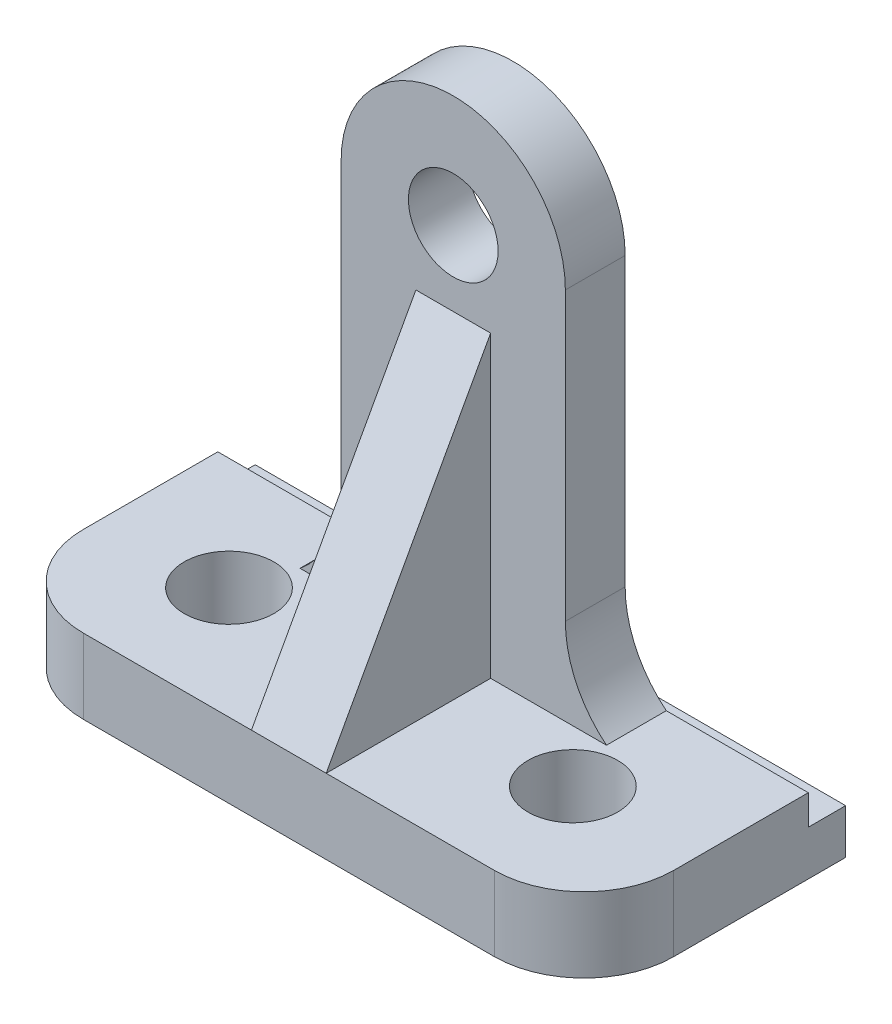
ISO-10303-21;
HEADER;
FILE_DESCRIPTION(('STEP AP214'),'2;1');
FILE_NAME('part.step','',(''),(''),'','','');
FILE_SCHEMA(('AUTOMOTIVE_DESIGN { 1 0 10303 214 1 1 1 1 }'));
ENDSEC;
DATA;
#1=APPLICATION_CONTEXT('core data for automotive mechanical design processes');
#2=APPLICATION_PROTOCOL_DEFINITION('international standard','automotive_design',2000,#1);
#3=PRODUCT_CONTEXT('',#1,'mechanical');
#4=PRODUCT('Part','Part','',(#3));
#5=PRODUCT_RELATED_PRODUCT_CATEGORY('part','',(#4));
#6=PRODUCT_DEFINITION_FORMATION('','',#4);
#7=PRODUCT_DEFINITION_CONTEXT('part definition',#1,'design');
#8=PRODUCT_DEFINITION('design','',#6,#7);
#9=PRODUCT_DEFINITION_SHAPE('','',#8);
#10=(LENGTH_UNIT() NAMED_UNIT(*) SI_UNIT(.MILLI.,.METRE.));
#11=(NAMED_UNIT(*) PLANE_ANGLE_UNIT() SI_UNIT($,.RADIAN.));
#12=(NAMED_UNIT(*) SI_UNIT($,.STERADIAN.) SOLID_ANGLE_UNIT());
#13=UNCERTAINTY_MEASURE_WITH_UNIT(LENGTH_MEASURE(1.E-05),#10,'distance_accuracy_value','');
#14=(GEOMETRIC_REPRESENTATION_CONTEXT(3) GLOBAL_UNCERTAINTY_ASSIGNED_CONTEXT((#13)) GLOBAL_UNIT_ASSIGNED_CONTEXT((#10,
#11,#12)) REPRESENTATION_CONTEXT('',''));
#15=CARTESIAN_POINT('',(0.,0.,0.));
#16=DIRECTION('',(0.,0.,1.));
#17=DIRECTION('',(1.,0.,0.));
#18=AXIS2_PLACEMENT_3D('',#15,#16,#17);
#19=CARTESIAN_POINT('',(27.5,10.,23.));
#20=DIRECTION('',(0.,-1.,0.));
#21=DIRECTION('',(0.,0.,-1.));
#22=AXIS2_PLACEMENT_3D('',#19,#20,#21);
#23=PLANE('',#22);
#24=CARTESIAN_POINT('',(-23.,10.,20.));
#25=DIRECTION('',(0.,1.,0.));
#26=DIRECTION('',(0.,0.,-1.));
#27=AXIS2_PLACEMENT_3D('',#24,#25,#26);
#28=CIRCLE('',#27,6.);
#29=CARTESIAN_POINT('',(-23.,10.,26.));
#30=VERTEX_POINT('',#29);
#31=EDGE_CURVE('E231',#30,#30,#28,.T.);
#32=ORIENTED_EDGE('',*,*,#31,.F.);
#33=EDGE_LOOP('',(#32));
#34=FACE_BOUND('',#33,.T.);
#35=DIRECTION('',(0.,0.,1.));
#36=VECTOR('',#35,1.);
#37=CARTESIAN_POINT('',(-5.,10.,23.));
#38=LINE('',#37,#36);
#39=CARTESIAN_POINT('',(-5.,10.,13.));
#40=VERTEX_POINT('',#39);
#41=CARTESIAN_POINT('',(-5.,10.,35.));
#42=VERTEX_POINT('',#41);
#43=EDGE_CURVE('E150',#40,#42,#38,.T.);
#44=ORIENTED_EDGE('',*,*,#43,.F.);
#45=DIRECTION('',(1.,0.,0.));
#46=VECTOR('',#45,1.);
#47=CARTESIAN_POINT('',(-20.5,10.,13.));
#48=LINE('',#47,#46);
#49=CARTESIAN_POINT('',(-20.5,10.,13.));
#50=VERTEX_POINT('',#49);
#51=EDGE_CURVE('E264',#50,#40,#48,.T.);
#52=ORIENTED_EDGE('',*,*,#51,.F.);
#53=DIRECTION('',(0.,0.,-1.));
#54=VECTOR('',#53,1.);
#55=CARTESIAN_POINT('',(-20.5,10.,13.));
#56=LINE('',#55,#54);
#57=CARTESIAN_POINT('',(-20.5,10.,5.));
#58=VERTEX_POINT('',#57);
#59=EDGE_CURVE('E279',#50,#58,#56,.T.);
#60=ORIENTED_EDGE('',*,*,#59,.T.);
#61=DIRECTION('',(1.,0.,0.));
#62=VECTOR('',#61,1.);
#63=CARTESIAN_POINT('',(-45.9031242374329,10.,5.));
#64=LINE('',#63,#62);
#65=CARTESIAN_POINT('',(-39.5,10.,5.));
#66=VERTEX_POINT('',#65);
#67=EDGE_CURVE('E301',#66,#58,#64,.T.);
#68=ORIENTED_EDGE('',*,*,#67,.F.);
#69=DIRECTION('',(0.,0.,1.));
#70=VECTOR('',#69,1.);
#71=CARTESIAN_POINT('',(-39.5,10.,23.));
#72=LINE('',#71,#70);
#73=CARTESIAN_POINT('',(-39.5,10.,23.));
#74=VERTEX_POINT('',#73);
#75=EDGE_CURVE('E208',#66,#74,#72,.T.);
#76=ORIENTED_EDGE('',*,*,#75,.T.);
#77=CARTESIAN_POINT('',(-27.5,10.,23.));
#78=DIRECTION('',(0.,1.,0.));
#79=DIRECTION('',(0.,0.,-1.));
#80=AXIS2_PLACEMENT_3D('',#77,#78,#79);
#81=CIRCLE('',#80,12.);
#82=CARTESIAN_POINT('',(-27.5,10.,35.));
#83=VERTEX_POINT('',#82);
#84=EDGE_CURVE('E181',#74,#83,#81,.T.);
#85=ORIENTED_EDGE('',*,*,#84,.T.);
#86=DIRECTION('',(1.,0.,0.));
#87=VECTOR('',#86,1.);
#88=CARTESIAN_POINT('',(27.5,10.,35.));
#89=LINE('',#88,#87);
#90=EDGE_CURVE('E175',#83,#42,#89,.T.);
#91=ORIENTED_EDGE('',*,*,#90,.T.);
#92=EDGE_LOOP('',(#44,#52,#60,#68,#76,#85,#91));
#93=FACE_BOUND('',#92,.T.);
#94=ADVANCED_FACE('F32',(#34,#93),#23,.F.);
#95=CARTESIAN_POINT('',(23.,10.,20.));
#96=DIRECTION('',(0.,1.,0.));
#97=DIRECTION('',(0.,0.,1.));
#98=AXIS2_PLACEMENT_3D('',#95,#96,#97);
#99=CIRCLE('',#98,6.);
#100=CARTESIAN_POINT('',(23.,10.,26.));
#101=VERTEX_POINT('',#100);
#102=EDGE_CURVE('E223',#101,#101,#99,.T.);
#103=ORIENTED_EDGE('',*,*,#102,.F.);
#104=EDGE_LOOP('',(#103));
#105=FACE_BOUND('',#104,.T.);
#106=CARTESIAN_POINT('',(5.,10.,13.));
#107=VERTEX_POINT('',#106);
#108=CARTESIAN_POINT('',(20.5,10.,13.));
#109=VERTEX_POINT('',#108);
#110=EDGE_CURVE('E263',#107,#109,#48,.T.);
#111=ORIENTED_EDGE('',*,*,#110,.F.);
#112=DIRECTION('',(0.,0.,1.));
#113=VECTOR('',#112,1.);
#114=CARTESIAN_POINT('',(5.,10.,23.));
#115=LINE('',#114,#113);
#116=CARTESIAN_POINT('',(5.,10.,35.));
#117=VERTEX_POINT('',#116);
#118=EDGE_CURVE('E236',#107,#117,#115,.T.);
#119=ORIENTED_EDGE('',*,*,#118,.T.);
#120=CARTESIAN_POINT('',(27.5,10.,35.));
#121=VERTEX_POINT('',#120);
#122=EDGE_CURVE('E177',#117,#121,#89,.T.);
#123=ORIENTED_EDGE('',*,*,#122,.T.);
#124=CARTESIAN_POINT('',(27.5,10.,23.));
#125=DIRECTION('',(0.,1.,0.));
#126=DIRECTION('',(0.,0.,-1.));
#127=AXIS2_PLACEMENT_3D('',#124,#125,#126);
#128=CIRCLE('',#127,12.);
#129=CARTESIAN_POINT('',(39.5,10.,23.));
#130=VERTEX_POINT('',#129);
#131=EDGE_CURVE('E183',#121,#130,#128,.T.);
#132=ORIENTED_EDGE('',*,*,#131,.T.);
#133=DIRECTION('',(0.,0.,-1.));
#134=VECTOR('',#133,1.);
#135=CARTESIAN_POINT('',(39.5,10.,0.));
#136=LINE('',#135,#134);
#137=CARTESIAN_POINT('',(39.5,10.,5.));
#138=VERTEX_POINT('',#137);
#139=EDGE_CURVE('E185',#130,#138,#136,.T.);
#140=ORIENTED_EDGE('',*,*,#139,.T.);
#141=CARTESIAN_POINT('',(20.5,10.,5.));
#142=VERTEX_POINT('',#141);
#143=EDGE_CURVE('E297',#142,#138,#64,.T.);
#144=ORIENTED_EDGE('',*,*,#143,.F.);
#145=DIRECTION('',(0.,0.,-1.));
#146=VECTOR('',#145,1.);
#147=CARTESIAN_POINT('',(20.5,10.,13.));
#148=LINE('',#147,#146);
#149=EDGE_CURVE('E276',#109,#142,#148,.T.);
#150=ORIENTED_EDGE('',*,*,#149,.F.);
#151=EDGE_LOOP('',(#111,#119,#123,#132,#140,#144,#150));
#152=FACE_BOUND('',#151,.T.);
#153=ADVANCED_FACE('F333',(#105,#152),#23,.F.);
#154=CARTESIAN_POINT('',(-39.5,10.,23.));
#155=DIRECTION('',(1.,0.,0.));
#156=DIRECTION('',(0.,0.,-1.));
#157=AXIS2_PLACEMENT_3D('',#154,#155,#156);
#158=PLANE('',#157);
#159=DIRECTION('',(0.,1.,0.));
#160=VECTOR('',#159,1.);
#161=CARTESIAN_POINT('',(-39.5,6.,5.));
#162=LINE('',#161,#160);
#163=CARTESIAN_POINT('',(-39.5,6.,5.));
#164=VERTEX_POINT('',#163);
#165=EDGE_CURVE('E197',#164,#66,#162,.T.);
#166=ORIENTED_EDGE('',*,*,#165,.F.);
#167=DIRECTION('',(0.,0.,1.));
#168=VECTOR('',#167,1.);
#169=CARTESIAN_POINT('',(-39.5,6.,0.));
#170=LINE('',#169,#168);
#171=CARTESIAN_POINT('',(-39.5,6.,0.));
#172=VERTEX_POINT('',#171);
#173=EDGE_CURVE('E289',#172,#164,#170,.T.);
#174=ORIENTED_EDGE('',*,*,#173,.F.);
#175=DIRECTION('',(0.,-1.,0.));
#176=VECTOR('',#175,1.);
#177=CARTESIAN_POINT('',(-39.5,10.,0.));
#178=LINE('',#177,#176);
#179=CARTESIAN_POINT('',(-39.5,0.,0.));
#180=VERTEX_POINT('',#179);
#181=EDGE_CURVE('E192',#172,#180,#178,.T.);
#182=ORIENTED_EDGE('',*,*,#181,.T.);
#183=DIRECTION('',(0.,0.,1.));
#184=VECTOR('',#183,1.);
#185=CARTESIAN_POINT('',(-39.5,0.,23.));
#186=LINE('',#185,#184);
#187=CARTESIAN_POINT('',(-39.5,0.,23.));
#188=VERTEX_POINT('',#187);
#189=EDGE_CURVE('E193',#180,#188,#186,.T.);
#190=ORIENTED_EDGE('',*,*,#189,.T.);
#191=DIRECTION('',(0.,-1.,0.));
#192=VECTOR('',#191,1.);
#193=CARTESIAN_POINT('',(-39.5,10.,23.));
#194=LINE('',#193,#192);
#195=EDGE_CURVE('E41',#74,#188,#194,.T.);
#196=ORIENTED_EDGE('',*,*,#195,.F.);
#197=ORIENTED_EDGE('',*,*,#75,.F.);
#198=EDGE_LOOP('',(#166,#174,#182,#190,#196,#197));
#199=FACE_BOUND('',#198,.T.);
#200=ADVANCED_FACE('F34',(#199),#158,.F.);
#201=CARTESIAN_POINT('',(-27.5,10.,23.));
#202=DIRECTION('',(0.,-1.,0.));
#203=DIRECTION('',(0.,0.,-1.));
#204=AXIS2_PLACEMENT_3D('',#201,#202,#203);
#205=CYLINDRICAL_SURFACE('',#204,12.);
#206=CARTESIAN_POINT('',(-27.5,0.,23.));
#207=DIRECTION('',(0.,1.,0.));
#208=DIRECTION('',(0.,0.,-1.));
#209=AXIS2_PLACEMENT_3D('',#206,#207,#208);
#210=CIRCLE('',#209,12.);
#211=CARTESIAN_POINT('',(-27.5,0.,35.));
#212=VERTEX_POINT('',#211);
#213=EDGE_CURVE('E196',#188,#212,#210,.T.);
#214=ORIENTED_EDGE('',*,*,#213,.T.);
#215=DIRECTION('',(0.,-1.,0.));
#216=VECTOR('',#215,1.);
#217=CARTESIAN_POINT('',(-27.5,10.,35.));
#218=LINE('',#217,#216);
#219=EDGE_CURVE('E219',#83,#212,#218,.T.);
#220=ORIENTED_EDGE('',*,*,#219,.F.);
#221=ORIENTED_EDGE('',*,*,#84,.F.);
#222=ORIENTED_EDGE('',*,*,#195,.T.);
#223=EDGE_LOOP('',(#214,#220,#221,#222));
#224=FACE_BOUND('',#223,.T.);
#225=ADVANCED_FACE('F310',(#224),#205,.T.);
#226=CARTESIAN_POINT('',(27.5,10.,35.));
#227=DIRECTION('',(0.,0.,-1.));
#228=DIRECTION('',(-1.,0.,0.));
#229=AXIS2_PLACEMENT_3D('',#226,#227,#228);
#230=PLANE('',#229);
#231=ORIENTED_EDGE('',*,*,#122,.F.);
#232=DIRECTION('',(-1.,0.,0.));
#233=VECTOR('',#232,1.);
#234=CARTESIAN_POINT('',(27.5,10.,35.));
#235=LINE('',#234,#233);
#236=EDGE_CURVE('E164',#42,#117,#235,.F.);
#237=ORIENTED_EDGE('',*,*,#236,.F.);
#238=ORIENTED_EDGE('',*,*,#90,.F.);
#239=ORIENTED_EDGE('',*,*,#219,.T.);
#240=DIRECTION('',(1.,0.,0.));
#241=VECTOR('',#240,1.);
#242=CARTESIAN_POINT('',(27.5,0.,35.));
#243=LINE('',#242,#241);
#244=CARTESIAN_POINT('',(27.5,0.,35.));
#245=VERTEX_POINT('',#244);
#246=EDGE_CURVE('E199',#212,#245,#243,.T.);
#247=ORIENTED_EDGE('',*,*,#246,.T.);
#248=DIRECTION('',(0.,-1.,0.));
#249=VECTOR('',#248,1.);
#250=CARTESIAN_POINT('',(27.5,10.,35.));
#251=LINE('',#250,#249);
#252=EDGE_CURVE('E216',#121,#245,#251,.T.);
#253=ORIENTED_EDGE('',*,*,#252,.F.);
#254=EDGE_LOOP('',(#231,#237,#238,#239,#247,#253));
#255=FACE_BOUND('',#254,.T.);
#256=ADVANCED_FACE('F173',(#255),#230,.F.);
#257=CARTESIAN_POINT('',(27.5,10.,23.));
#258=DIRECTION('',(0.,-1.,0.));
#259=DIRECTION('',(0.,0.,-1.));
#260=AXIS2_PLACEMENT_3D('',#257,#258,#259);
#261=CYLINDRICAL_SURFACE('',#260,12.);
#262=CARTESIAN_POINT('',(27.5,0.,23.));
#263=DIRECTION('',(0.,1.,0.));
#264=DIRECTION('',(0.,0.,-1.));
#265=AXIS2_PLACEMENT_3D('',#262,#263,#264);
#266=CIRCLE('',#265,12.);
#267=CARTESIAN_POINT('',(39.5,0.,23.));
#268=VERTEX_POINT('',#267);
#269=EDGE_CURVE('E201',#245,#268,#266,.T.);
#270=ORIENTED_EDGE('',*,*,#269,.T.);
#271=DIRECTION('',(0.,-1.,0.));
#272=VECTOR('',#271,1.);
#273=CARTESIAN_POINT('',(39.5,10.,23.));
#274=LINE('',#273,#272);
#275=EDGE_CURVE('E213',#130,#268,#274,.T.);
#276=ORIENTED_EDGE('',*,*,#275,.F.);
#277=ORIENTED_EDGE('',*,*,#131,.F.);
#278=ORIENTED_EDGE('',*,*,#252,.T.);
#279=EDGE_LOOP('',(#270,#276,#277,#278));
#280=FACE_BOUND('',#279,.T.);
#281=ADVANCED_FACE('F322',(#280),#261,.T.);
#282=CARTESIAN_POINT('',(39.5,10.,0.));
#283=DIRECTION('',(-1.,0.,0.));
#284=DIRECTION('',(0.,0.,1.));
#285=AXIS2_PLACEMENT_3D('',#282,#283,#284);
#286=PLANE('',#285);
#287=DIRECTION('',(0.,-1.,0.));
#288=VECTOR('',#287,1.);
#289=CARTESIAN_POINT('',(39.5,10.,0.));
#290=LINE('',#289,#288);
#291=CARTESIAN_POINT('',(39.5,6.,0.));
#292=VERTEX_POINT('',#291);
#293=CARTESIAN_POINT('',(39.5,0.,0.));
#294=VERTEX_POINT('',#293);
#295=EDGE_CURVE('E211',#292,#294,#290,.T.);
#296=ORIENTED_EDGE('',*,*,#295,.F.);
#297=DIRECTION('',(0.,0.,-1.));
#298=VECTOR('',#297,1.);
#299=CARTESIAN_POINT('',(39.5,6.,0.));
#300=LINE('',#299,#298);
#301=CARTESIAN_POINT('',(39.5,6.,5.));
#302=VERTEX_POINT('',#301);
#303=EDGE_CURVE('E294',#302,#292,#300,.T.);
#304=ORIENTED_EDGE('',*,*,#303,.F.);
#305=DIRECTION('',(0.,-1.,0.));
#306=VECTOR('',#305,1.);
#307=CARTESIAN_POINT('',(39.5,6.,5.));
#308=LINE('',#307,#306);
#309=EDGE_CURVE('E288',#138,#302,#308,.T.);
#310=ORIENTED_EDGE('',*,*,#309,.F.);
#311=ORIENTED_EDGE('',*,*,#139,.F.);
#312=ORIENTED_EDGE('',*,*,#275,.T.);
#313=DIRECTION('',(0.,0.,-1.));
#314=VECTOR('',#313,1.);
#315=CARTESIAN_POINT('',(39.5,0.,0.));
#316=LINE('',#315,#314);
#317=EDGE_CURVE('E203',#268,#294,#316,.T.);
#318=ORIENTED_EDGE('',*,*,#317,.T.);
#319=EDGE_LOOP('',(#296,#304,#310,#311,#312,#318));
#320=FACE_BOUND('',#319,.T.);
#321=ADVANCED_FACE('F326',(#320),#286,.F.);
#322=CARTESIAN_POINT('',(-39.5,10.,0.));
#323=DIRECTION('',(0.,0.,1.));
#324=DIRECTION('',(1.,0.,0.));
#325=AXIS2_PLACEMENT_3D('',#322,#323,#324);
#326=PLANE('',#325);
#327=DIRECTION('',(-1.,0.,0.));
#328=VECTOR('',#327,1.);
#329=CARTESIAN_POINT('',(-39.5,0.,0.));
#330=LINE('',#329,#328);
#331=EDGE_CURVE('E206',#294,#180,#330,.T.);
#332=ORIENTED_EDGE('',*,*,#331,.T.);
#333=ORIENTED_EDGE('',*,*,#181,.F.);
#334=DIRECTION('',(1.,0.,0.));
#335=VECTOR('',#334,1.);
#336=CARTESIAN_POINT('',(-45.9031242374329,6.,0.));
#337=LINE('',#336,#335);
#338=EDGE_CURVE('E291',#172,#292,#337,.T.);
#339=ORIENTED_EDGE('',*,*,#338,.T.);
#340=ORIENTED_EDGE('',*,*,#295,.T.);
#341=EDGE_LOOP('',(#332,#333,#339,#340));
#342=FACE_BOUND('',#341,.T.);
#343=ADVANCED_FACE('F349',(#342),#326,.F.);
#344=CARTESIAN_POINT('',(27.5,0.,23.));
#345=DIRECTION('',(0.,-1.,0.));
#346=DIRECTION('',(0.,0.,-1.));
#347=AXIS2_PLACEMENT_3D('',#344,#345,#346);
#348=PLANE('',#347);
#349=CARTESIAN_POINT('',(-23.,0.,20.));
#350=DIRECTION('',(0.,-1.,0.));
#351=DIRECTION('',(0.,0.,-1.));
#352=AXIS2_PLACEMENT_3D('',#349,#350,#351);
#353=CIRCLE('',#352,6.);
#354=CARTESIAN_POINT('',(-23.,0.,26.));
#355=VERTEX_POINT('',#354);
#356=EDGE_CURVE('E36',#355,#355,#353,.T.);
#357=ORIENTED_EDGE('',*,*,#356,.F.);
#358=EDGE_LOOP('',(#357));
#359=FACE_BOUND('',#358,.T.);
#360=CARTESIAN_POINT('',(23.,0.,20.));
#361=DIRECTION('',(0.,-1.,0.));
#362=DIRECTION('',(0.,0.,-1.));
#363=AXIS2_PLACEMENT_3D('',#360,#361,#362);
#364=CIRCLE('',#363,6.);
#365=CARTESIAN_POINT('',(23.,0.,26.));
#366=VERTEX_POINT('',#365);
#367=EDGE_CURVE('E168',#366,#366,#364,.T.);
#368=ORIENTED_EDGE('',*,*,#367,.F.);
#369=EDGE_LOOP('',(#368));
#370=FACE_BOUND('',#369,.T.);
#371=ORIENTED_EDGE('',*,*,#269,.F.);
#372=ORIENTED_EDGE('',*,*,#246,.F.);
#373=ORIENTED_EDGE('',*,*,#213,.F.);
#374=ORIENTED_EDGE('',*,*,#189,.F.);
#375=ORIENTED_EDGE('',*,*,#331,.F.);
#376=ORIENTED_EDGE('',*,*,#317,.F.);
#377=EDGE_LOOP('',(#371,#372,#373,#374,#375,#376));
#378=FACE_BOUND('',#377,.T.);
#379=ADVANCED_FACE('F317',(#359,#370,#378),#348,.T.);
#380=CARTESIAN_POINT('',(-45.9031242374329,6.,0.));
#381=DIRECTION('',(0.,-1.,0.));
#382=DIRECTION('',(0.,0.,-1.));
#383=AXIS2_PLACEMENT_3D('',#380,#381,#382);
#384=PLANE('',#383);
#385=ORIENTED_EDGE('',*,*,#303,.T.);
#386=ORIENTED_EDGE('',*,*,#338,.F.);
#387=ORIENTED_EDGE('',*,*,#173,.T.);
#388=DIRECTION('',(1.,0.,0.));
#389=VECTOR('',#388,1.);
#390=CARTESIAN_POINT('',(-45.9031242374329,6.,5.));
#391=LINE('',#390,#389);
#392=EDGE_CURVE('E299',#164,#302,#391,.T.);
#393=ORIENTED_EDGE('',*,*,#392,.T.);
#394=EDGE_LOOP('',(#385,#386,#387,#393));
#395=FACE_BOUND('',#394,.T.);
#396=ADVANCED_FACE('F350',(#395),#384,.F.);
#397=CARTESIAN_POINT('',(-45.9031242374329,6.,5.));
#398=DIRECTION('',(0.,0.,1.));
#399=DIRECTION('',(0.,-1.,0.));
#400=AXIS2_PLACEMENT_3D('',#397,#398,#399);
#401=PLANE('',#400);
#402=CARTESIAN_POINT('',(0.,60.,4.99999999999998));
#403=DIRECTION('',(0.,0.,1.));
#404=DIRECTION('',(0.,-1.,0.));
#405=AXIS2_PLACEMENT_3D('',#402,#403,#404);
#406=CIRCLE('',#405,6.);
#407=CARTESIAN_POINT('',(6.,60.,4.99999999999998));
#408=VERTEX_POINT('',#407);
#409=EDGE_CURVE('E244',#408,#408,#406,.T.);
#410=ORIENTED_EDGE('',*,*,#409,.T.);
#411=EDGE_LOOP('',(#410));
#412=FACE_BOUND('',#411,.T.);
#413=ORIENTED_EDGE('',*,*,#309,.T.);
#414=ORIENTED_EDGE('',*,*,#392,.F.);
#415=ORIENTED_EDGE('',*,*,#165,.T.);
#416=ORIENTED_EDGE('',*,*,#67,.T.);
#417=CARTESIAN_POINT('',(-30.,21.6081867662439,5.));
#418=DIRECTION('',(0.,0.,1.));
#419=DIRECTION('',(0.,-1.,0.));
#420=AXIS2_PLACEMENT_3D('',#417,#418,#419);
#421=CIRCLE('',#420,15.);
#422=CARTESIAN_POINT('',(-15.,21.6081867662439,5.00000000000001));
#423=VERTEX_POINT('',#422);
#424=EDGE_CURVE('E254',#423,#58,#421,.F.);
#425=ORIENTED_EDGE('',*,*,#424,.F.);
#426=DIRECTION('',(0.,-1.,0.));
#427=VECTOR('',#426,1.);
#428=CARTESIAN_POINT('',(-15.,60.,5.));
#429=LINE('',#428,#427);
#430=CARTESIAN_POINT('',(-15.,60.,5.));
#431=VERTEX_POINT('',#430);
#432=EDGE_CURVE('E251',#431,#423,#429,.T.);
#433=ORIENTED_EDGE('',*,*,#432,.F.);
#434=CARTESIAN_POINT('',(0.,60.,5.));
#435=DIRECTION('',(0.,0.,1.));
#436=DIRECTION('',(0.,-1.,0.));
#437=AXIS2_PLACEMENT_3D('',#434,#435,#436);
#438=CIRCLE('',#437,15.);
#439=CARTESIAN_POINT('',(15.,60.,5.00000000000001));
#440=VERTEX_POINT('',#439);
#441=EDGE_CURVE('E57',#440,#431,#438,.T.);
#442=ORIENTED_EDGE('',*,*,#441,.F.);
#443=DIRECTION('',(0.,1.,0.));
#444=VECTOR('',#443,1.);
#445=CARTESIAN_POINT('',(15.,60.,5.));
#446=LINE('',#445,#444);
#447=CARTESIAN_POINT('',(15.,21.6081867662439,5.00000000000001));
#448=VERTEX_POINT('',#447);
#449=EDGE_CURVE('E11',#448,#440,#446,.T.);
#450=ORIENTED_EDGE('',*,*,#449,.F.);
#451=CARTESIAN_POINT('',(30.,21.6081867662439,5.));
#452=DIRECTION('',(0.,0.,1.));
#453=DIRECTION('',(0.,-1.,0.));
#454=AXIS2_PLACEMENT_3D('',#451,#452,#453);
#455=CIRCLE('',#454,15.);
#456=EDGE_CURVE('E247',#142,#448,#455,.F.);
#457=ORIENTED_EDGE('',*,*,#456,.F.);
#458=ORIENTED_EDGE('',*,*,#143,.T.);
#459=EDGE_LOOP('',(#413,#414,#415,#416,#425,#433,#442,#450,#457,#458));
#460=FACE_BOUND('',#459,.T.);
#461=ADVANCED_FACE('F345',(#412,#460),#401,.F.);
#462=CARTESIAN_POINT('',(0.,60.,13.));
#463=DIRECTION('',(0.,0.,-1.));
#464=DIRECTION('',(-1.,0.,0.));
#465=AXIS2_PLACEMENT_3D('',#462,#463,#464);
#466=CYLINDRICAL_SURFACE('',#465,15.);
#467=ORIENTED_EDGE('',*,*,#441,.T.);
#468=DIRECTION('',(0.,0.,-1.));
#469=VECTOR('',#468,1.);
#470=CARTESIAN_POINT('',(-15.,60.,13.));
#471=LINE('',#470,#469);
#472=CARTESIAN_POINT('',(-15.,60.,13.));
#473=VERTEX_POINT('',#472);
#474=EDGE_CURVE('E285',#473,#431,#471,.T.);
#475=ORIENTED_EDGE('',*,*,#474,.F.);
#476=CARTESIAN_POINT('',(0.,60.,13.));
#477=DIRECTION('',(0.,0.,1.));
#478=DIRECTION('',(1.,0.,0.));
#479=AXIS2_PLACEMENT_3D('',#476,#477,#478);
#480=CIRCLE('',#479,15.);
#481=CARTESIAN_POINT('',(15.,60.,13.));
#482=VERTEX_POINT('',#481);
#483=EDGE_CURVE('E256',#482,#473,#480,.T.);
#484=ORIENTED_EDGE('',*,*,#483,.F.);
#485=DIRECTION('',(0.,0.,-1.));
#486=VECTOR('',#485,1.);
#487=CARTESIAN_POINT('',(15.,60.,13.));
#488=LINE('',#487,#486);
#489=EDGE_CURVE('E270',#482,#440,#488,.T.);
#490=ORIENTED_EDGE('',*,*,#489,.T.);
#491=EDGE_LOOP('',(#467,#475,#484,#490));
#492=FACE_BOUND('',#491,.T.);
#493=ADVANCED_FACE('F361',(#492),#466,.T.);
#494=CARTESIAN_POINT('',(-15.,60.,13.));
#495=DIRECTION('',(1.,0.,0.));
#496=DIRECTION('',(0.,1.,0.));
#497=AXIS2_PLACEMENT_3D('',#494,#495,#496);
#498=PLANE('',#497);
#499=ORIENTED_EDGE('',*,*,#474,.T.);
#500=ORIENTED_EDGE('',*,*,#432,.T.);
#501=DIRECTION('',(0.,0.,-1.));
#502=VECTOR('',#501,1.);
#503=CARTESIAN_POINT('',(-15.,21.6081867662439,13.));
#504=LINE('',#503,#502);
#505=CARTESIAN_POINT('',(-15.,21.6081867662439,13.));
#506=VERTEX_POINT('',#505);
#507=EDGE_CURVE('E282',#506,#423,#504,.T.);
#508=ORIENTED_EDGE('',*,*,#507,.F.);
#509=DIRECTION('',(0.,-1.,0.));
#510=VECTOR('',#509,1.);
#511=CARTESIAN_POINT('',(-15.,60.,13.));
#512=LINE('',#511,#510);
#513=EDGE_CURVE('E259',#473,#506,#512,.T.);
#514=ORIENTED_EDGE('',*,*,#513,.F.);
#515=EDGE_LOOP('',(#499,#500,#508,#514));
#516=FACE_BOUND('',#515,.T.);
#517=ADVANCED_FACE('F363',(#516),#498,.F.);
#518=CARTESIAN_POINT('',(-30.,21.6081867662439,13.));
#519=DIRECTION('',(0.,0.,-1.));
#520=DIRECTION('',(-1.,0.,0.));
#521=AXIS2_PLACEMENT_3D('',#518,#519,#520);
#522=CYLINDRICAL_SURFACE('',#521,15.);
#523=ORIENTED_EDGE('',*,*,#507,.T.);
#524=ORIENTED_EDGE('',*,*,#424,.T.);
#525=ORIENTED_EDGE('',*,*,#59,.F.);
#526=CARTESIAN_POINT('',(-30.,21.6081867662439,13.));
#527=DIRECTION('',(0.,0.,-1.));
#528=DIRECTION('',(-1.,0.,0.));
#529=AXIS2_PLACEMENT_3D('',#526,#527,#528);
#530=CIRCLE('',#529,15.);
#531=EDGE_CURVE('E261',#506,#50,#530,.T.);
#532=ORIENTED_EDGE('',*,*,#531,.F.);
#533=EDGE_LOOP('',(#523,#524,#525,#532));
#534=FACE_BOUND('',#533,.T.);
#535=ADVANCED_FACE('F365',(#534),#522,.F.);
#536=CARTESIAN_POINT('',(30.,21.6081867662439,13.));
#537=DIRECTION('',(0.,0.,-1.));
#538=DIRECTION('',(-1.,0.,0.));
#539=AXIS2_PLACEMENT_3D('',#536,#537,#538);
#540=CYLINDRICAL_SURFACE('',#539,15.);
#541=ORIENTED_EDGE('',*,*,#149,.T.);
#542=ORIENTED_EDGE('',*,*,#456,.T.);
#543=DIRECTION('',(0.,0.,-1.));
#544=VECTOR('',#543,1.);
#545=CARTESIAN_POINT('',(15.,21.6081867662439,13.));
#546=LINE('',#545,#544);
#547=CARTESIAN_POINT('',(15.,21.6081867662439,13.));
#548=VERTEX_POINT('',#547);
#549=EDGE_CURVE('E273',#548,#448,#546,.T.);
#550=ORIENTED_EDGE('',*,*,#549,.F.);
#551=CARTESIAN_POINT('',(30.,21.6081867662439,13.));
#552=DIRECTION('',(0.,0.,-1.));
#553=DIRECTION('',(1.,0.,0.));
#554=AXIS2_PLACEMENT_3D('',#551,#552,#553);
#555=CIRCLE('',#554,15.);
#556=EDGE_CURVE('E266',#109,#548,#555,.T.);
#557=ORIENTED_EDGE('',*,*,#556,.F.);
#558=EDGE_LOOP('',(#541,#542,#550,#557));
#559=FACE_BOUND('',#558,.T.);
#560=ADVANCED_FACE('F353',(#559),#540,.F.);
#561=CARTESIAN_POINT('',(15.,60.,13.));
#562=DIRECTION('',(-1.,0.,0.));
#563=DIRECTION('',(0.,0.,1.));
#564=AXIS2_PLACEMENT_3D('',#561,#562,#563);
#565=PLANE('',#564);
#566=ORIENTED_EDGE('',*,*,#549,.T.);
#567=ORIENTED_EDGE('',*,*,#449,.T.);
#568=ORIENTED_EDGE('',*,*,#489,.F.);
#569=DIRECTION('',(0.,1.,0.));
#570=VECTOR('',#569,1.);
#571=CARTESIAN_POINT('',(15.,60.,13.));
#572=LINE('',#571,#570);
#573=EDGE_CURVE('E268',#548,#482,#572,.T.);
#574=ORIENTED_EDGE('',*,*,#573,.F.);
#575=EDGE_LOOP('',(#566,#567,#568,#574));
#576=FACE_BOUND('',#575,.T.);
#577=ADVANCED_FACE('F359',(#576),#565,.F.);
#578=CARTESIAN_POINT('',(0.,60.,13.));
#579=DIRECTION('',(0.,0.,1.));
#580=DIRECTION('',(1.,0.,0.));
#581=AXIS2_PLACEMENT_3D('',#578,#579,#580);
#582=PLANE('',#581);
#583=DIRECTION('',(0.,1.,0.));
#584=VECTOR('',#583,1.);
#585=CARTESIAN_POINT('',(5.,60.,13.));
#586=LINE('',#585,#584);
#587=CARTESIAN_POINT('',(5.,50.,13.));
#588=VERTEX_POINT('',#587);
#589=EDGE_CURVE('E239',#107,#588,#586,.T.);
#590=ORIENTED_EDGE('',*,*,#589,.F.);
#591=ORIENTED_EDGE('',*,*,#110,.T.);
#592=ORIENTED_EDGE('',*,*,#556,.T.);
#593=ORIENTED_EDGE('',*,*,#573,.T.);
#594=ORIENTED_EDGE('',*,*,#483,.T.);
#595=ORIENTED_EDGE('',*,*,#513,.T.);
#596=ORIENTED_EDGE('',*,*,#531,.T.);
#597=ORIENTED_EDGE('',*,*,#51,.T.);
#598=DIRECTION('',(0.,1.,0.));
#599=VECTOR('',#598,1.);
#600=CARTESIAN_POINT('',(-5.,60.,13.));
#601=LINE('',#600,#599);
#602=CARTESIAN_POINT('',(-5.,50.,13.));
#603=VERTEX_POINT('',#602);
#604=EDGE_CURVE('E153',#40,#603,#601,.T.);
#605=ORIENTED_EDGE('',*,*,#604,.T.);
#606=DIRECTION('',(1.,0.,0.));
#607=VECTOR('',#606,1.);
#608=CARTESIAN_POINT('',(0.,50.,13.));
#609=LINE('',#608,#607);
#610=EDGE_CURVE('E167',#588,#603,#609,.F.);
#611=ORIENTED_EDGE('',*,*,#610,.F.);
#612=EDGE_LOOP('',(#590,#591,#592,#593,#594,#595,#596,#597,#605,#611));
#613=FACE_BOUND('',#612,.T.);
#614=CARTESIAN_POINT('',(0.,60.,13.));
#615=DIRECTION('',(0.,0.,1.));
#616=DIRECTION('',(1.,0.,0.));
#617=AXIS2_PLACEMENT_3D('',#614,#615,#616);
#618=CIRCLE('',#617,6.);
#619=CARTESIAN_POINT('',(6.,60.,13.));
#620=VERTEX_POINT('',#619);
#621=EDGE_CURVE('E178',#620,#620,#618,.T.);
#622=ORIENTED_EDGE('',*,*,#621,.F.);
#623=EDGE_LOOP('',(#622));
#624=FACE_BOUND('',#623,.T.);
#625=ADVANCED_FACE('F339',(#613,#624),#582,.T.);
#626=CARTESIAN_POINT('',(0.,60.,0.));
#627=DIRECTION('',(0.,0.,1.));
#628=DIRECTION('',(1.,0.,0.));
#629=AXIS2_PLACEMENT_3D('',#626,#627,#628);
#630=CYLINDRICAL_SURFACE('',#629,6.);
#631=CARTESIAN_POINT('',(6.,60.,4.99999999999998));
#632=CARTESIAN_POINT('',(6.,60.,5.08333333333331));
#633=CARTESIAN_POINT('',(6.,60.,5.16666666666664));
#634=CARTESIAN_POINT('',(6.,60.,5.33333333333331));
#635=CARTESIAN_POINT('',(6.,60.,5.41666666666664));
#636=CARTESIAN_POINT('',(6.,60.,5.58333333333331));
#637=CARTESIAN_POINT('',(6.,60.,5.66666666666664));
#638=CARTESIAN_POINT('',(6.,60.,5.83333333333331));
#639=CARTESIAN_POINT('',(6.,60.,5.91666666666664));
#640=CARTESIAN_POINT('',(6.,60.,6.08333333333331));
#641=CARTESIAN_POINT('',(6.,60.,6.16666666666665));
#642=CARTESIAN_POINT('',(6.,60.,6.33333333333331));
#643=CARTESIAN_POINT('',(6.,60.,6.41666666666665));
#644=CARTESIAN_POINT('',(6.,60.,6.58333333333331));
#645=CARTESIAN_POINT('',(6.,60.,6.66666666666665));
#646=CARTESIAN_POINT('',(6.,60.,6.83333333333331));
#647=CARTESIAN_POINT('',(6.,60.,6.91666666666665));
#648=CARTESIAN_POINT('',(6.,60.,7.08333333333332));
#649=CARTESIAN_POINT('',(6.,60.,7.16666666666665));
#650=CARTESIAN_POINT('',(6.,60.,7.33333333333332));
#651=CARTESIAN_POINT('',(6.,60.,7.41666666666665));
#652=CARTESIAN_POINT('',(6.,60.,7.58333333333332));
#653=CARTESIAN_POINT('',(6.,60.,7.66666666666665));
#654=CARTESIAN_POINT('',(6.,60.,7.83333333333332));
#655=CARTESIAN_POINT('',(6.,60.,7.91666666666665));
#656=CARTESIAN_POINT('',(6.,60.,8.08333333333332));
#657=CARTESIAN_POINT('',(6.,60.,8.16666666666665));
#658=CARTESIAN_POINT('',(6.,60.,8.33333333333332));
#659=CARTESIAN_POINT('',(6.,60.,8.41666666666665));
#660=CARTESIAN_POINT('',(6.,60.,8.58333333333332));
#661=CARTESIAN_POINT('',(6.,60.,8.66666666666665));
#662=CARTESIAN_POINT('',(6.,60.,8.83333333333332));
#663=CARTESIAN_POINT('',(6.,60.,8.91666666666665));
#664=CARTESIAN_POINT('',(6.,60.,9.08333333333332));
#665=CARTESIAN_POINT('',(6.,60.,9.16666666666666));
#666=CARTESIAN_POINT('',(6.,60.,9.33333333333332));
#667=CARTESIAN_POINT('',(6.,60.,9.41666666666666));
#668=CARTESIAN_POINT('',(6.,60.,9.58333333333332));
#669=CARTESIAN_POINT('',(6.,60.,9.66666666666666));
#670=CARTESIAN_POINT('',(6.,60.,9.83333333333332));
#671=CARTESIAN_POINT('',(6.,60.,9.91666666666666));
#672=CARTESIAN_POINT('',(6.,60.,10.0833333333333));
#673=CARTESIAN_POINT('',(6.,60.,10.1666666666667));
#674=CARTESIAN_POINT('',(6.,60.,10.3333333333333));
#675=CARTESIAN_POINT('',(6.,60.,10.4166666666667));
#676=CARTESIAN_POINT('',(6.,60.,10.5833333333333));
#677=CARTESIAN_POINT('',(6.,60.,10.6666666666667));
#678=CARTESIAN_POINT('',(6.,60.,10.8333333333333));
#679=CARTESIAN_POINT('',(6.,60.,10.9166666666667));
#680=CARTESIAN_POINT('',(6.,60.,11.0833333333333));
#681=CARTESIAN_POINT('',(6.,60.,11.1666666666667));
#682=CARTESIAN_POINT('',(6.,60.,11.3333333333333));
#683=CARTESIAN_POINT('',(6.,60.,11.4166666666667));
#684=CARTESIAN_POINT('',(6.,60.,11.5833333333333));
#685=CARTESIAN_POINT('',(6.,60.,11.6666666666667));
#686=CARTESIAN_POINT('',(6.,60.,11.8333333333333));
#687=CARTESIAN_POINT('',(6.,60.,11.9166666666667));
#688=CARTESIAN_POINT('',(6.,60.,12.0833333333333));
#689=CARTESIAN_POINT('',(6.,60.,12.1666666666667));
#690=CARTESIAN_POINT('',(6.,60.,12.3333333333333));
#691=CARTESIAN_POINT('',(6.,60.,12.4166666666667));
#692=CARTESIAN_POINT('',(6.,60.,12.5833333333333));
#693=CARTESIAN_POINT('',(6.,60.,12.6666666666667));
#694=CARTESIAN_POINT('',(6.,60.,12.8333333333333));
#695=CARTESIAN_POINT('',(6.,60.,12.9166666666667));
#696=CARTESIAN_POINT('',(6.,60.,13.));
#697=B_SPLINE_CURVE_WITH_KNOTS('',3,(#631,#632,#633,#634,#635,#636,#637,#638,#639,#640,#641,
#642,#643,#644,#645,#646,#647,#648,#649,#650,#651,#652,#653,#654,#655,#656,#657,#658,#659,#660,
#661,#662,#663,#664,#665,#666,#667,#668,#669,#670,#671,#672,#673,#674,#675,#676,#677,#678,#679,
#680,#681,#682,#683,#684,#685,#686,#687,#688,#689,#690,#691,#692,#693,#694,#695,#696),
.UNSPECIFIED.,.F.,.F.,(4,2,2,2,2,2,2,2,2,2,2,2,2,2,2,2,2,2,2,2,2,2,2,2,2,2,2,2,2,2,2,2,4),(0.,
0.250000000000001,0.500000000000001,0.750000000000002,1.,1.25,1.5,1.75000000000001,
2.00000000000001,2.25000000000001,2.50000000000001,2.75000000000001,3.00000000000001,
3.25000000000001,3.50000000000001,3.75000000000001,4.00000000000001,4.25000000000001,
4.50000000000001,4.75000000000001,5.00000000000001,5.25000000000001,5.50000000000002,
5.75000000000002,6.00000000000002,6.25000000000002,6.50000000000002,6.75000000000002,
7.00000000000002,7.25000000000002,7.50000000000002,7.75000000000002,8.00000000000002),.UNSPECIFIED.);
#698=EDGE_CURVE('BSEAM453',#408,#620,#697,.T.);
#699=ORIENTED_EDGE('',*,*,#409,.F.);
#700=ORIENTED_EDGE('',*,*,#621,.T.);
#701=ORIENTED_EDGE('',*,*,#698,.T.);
#702=ORIENTED_EDGE('',*,*,#698,.F.);
#703=EDGE_LOOP('',(#699,#701,#700,#702));
#704=FACE_BOUND('',#703,.T.);
#705=ADVANCED_FACE('F453',(#704),#630,.F.);
#706=CARTESIAN_POINT('',(0.,10.,35.));
#707=DIRECTION('',(0.,-0.481918749772156,-0.876215908676647));
#708=DIRECTION('',(0.,0.876215908676647,-0.481918749772156));
#709=AXIS2_PLACEMENT_3D('',#706,#707,#708);
#710=PLANE('',#709);
#711=DIRECTION('',(0.,0.876215908676647,-0.481918749772156));
#712=VECTOR('',#711,1.);
#713=CARTESIAN_POINT('',(-5.,10.,35.));
#714=LINE('',#713,#712);
#715=EDGE_CURVE('E49',#42,#603,#714,.T.);
#716=ORIENTED_EDGE('',*,*,#715,.F.);
#717=ORIENTED_EDGE('',*,*,#236,.T.);
#718=DIRECTION('',(0.,0.876215908676647,-0.481918749772156));
#719=VECTOR('',#718,1.);
#720=CARTESIAN_POINT('',(5.,10.,35.));
#721=LINE('',#720,#719);
#722=EDGE_CURVE('E158',#117,#588,#721,.T.);
#723=ORIENTED_EDGE('',*,*,#722,.T.);
#724=ORIENTED_EDGE('',*,*,#610,.T.);
#725=EDGE_LOOP('',(#716,#717,#723,#724));
#726=FACE_BOUND('',#725,.T.);
#727=ADVANCED_FACE('F162',(#726),#710,.F.);
#728=CARTESIAN_POINT('',(5.,37.5,17.5));
#729=DIRECTION('',(1.,0.,0.));
#730=DIRECTION('',(0.,0.,-1.));
#731=AXIS2_PLACEMENT_3D('',#728,#729,#730);
#732=PLANE('',#731);
#733=ORIENTED_EDGE('',*,*,#118,.F.);
#734=ORIENTED_EDGE('',*,*,#589,.T.);
#735=ORIENTED_EDGE('',*,*,#722,.F.);
#736=EDGE_LOOP('',(#733,#734,#735));
#737=FACE_BOUND('',#736,.T.);
#738=ADVANCED_FACE('F337',(#737),#732,.T.);
#739=CARTESIAN_POINT('',(-5.,37.5,17.5));
#740=DIRECTION('',(1.,0.,0.));
#741=DIRECTION('',(0.,0.,-1.));
#742=AXIS2_PLACEMENT_3D('',#739,#740,#741);
#743=PLANE('',#742);
#744=ORIENTED_EDGE('',*,*,#604,.F.);
#745=ORIENTED_EDGE('',*,*,#43,.T.);
#746=ORIENTED_EDGE('',*,*,#715,.T.);
#747=EDGE_LOOP('',(#744,#745,#746));
#748=FACE_BOUND('',#747,.T.);
#749=ADVANCED_FACE('F151',(#748),#743,.F.);
#750=CARTESIAN_POINT('',(23.,-3.,20.));
#751=DIRECTION('',(0.,1.,0.));
#752=DIRECTION('',(0.,0.,1.));
#753=AXIS2_PLACEMENT_3D('',#750,#751,#752);
#754=CYLINDRICAL_SURFACE('',#753,6.);
#755=CARTESIAN_POINT('',(23.,0.,26.));
#756=CARTESIAN_POINT('',(23.,0.104166666666667,26.));
#757=CARTESIAN_POINT('',(23.,0.208333333333334,26.));
#758=CARTESIAN_POINT('',(23.,0.416666666666667,26.));
#759=CARTESIAN_POINT('',(23.,0.520833333333334,26.));
#760=CARTESIAN_POINT('',(23.,0.729166666666667,26.));
#761=CARTESIAN_POINT('',(23.,0.833333333333333,26.));
#762=CARTESIAN_POINT('',(23.,1.04166666666667,26.));
#763=CARTESIAN_POINT('',(23.,1.14583333333333,26.));
#764=CARTESIAN_POINT('',(23.,1.35416666666667,26.));
#765=CARTESIAN_POINT('',(23.,1.45833333333333,26.));
#766=CARTESIAN_POINT('',(23.,1.66666666666667,26.));
#767=CARTESIAN_POINT('',(23.,1.77083333333333,26.));
#768=CARTESIAN_POINT('',(23.,1.97916666666667,26.));
#769=CARTESIAN_POINT('',(23.,2.08333333333333,26.));
#770=CARTESIAN_POINT('',(23.,2.29166666666667,26.));
#771=CARTESIAN_POINT('',(23.,2.39583333333333,26.));
#772=CARTESIAN_POINT('',(23.,2.60416666666667,26.));
#773=CARTESIAN_POINT('',(23.,2.70833333333333,26.));
#774=CARTESIAN_POINT('',(23.,2.91666666666667,26.));
#775=CARTESIAN_POINT('',(23.,3.02083333333333,26.));
#776=CARTESIAN_POINT('',(23.,3.22916666666667,26.));
#777=CARTESIAN_POINT('',(23.,3.33333333333333,26.));
#778=CARTESIAN_POINT('',(23.,3.54166666666667,26.));
#779=CARTESIAN_POINT('',(23.,3.64583333333333,26.));
#780=CARTESIAN_POINT('',(23.,3.85416666666667,26.));
#781=CARTESIAN_POINT('',(23.,3.95833333333333,26.));
#782=CARTESIAN_POINT('',(23.,4.16666666666667,26.));
#783=CARTESIAN_POINT('',(23.,4.27083333333333,26.));
#784=CARTESIAN_POINT('',(23.,4.47916666666667,26.));
#785=CARTESIAN_POINT('',(23.,4.58333333333333,26.));
#786=CARTESIAN_POINT('',(23.,4.79166666666667,26.));
#787=CARTESIAN_POINT('',(23.,4.89583333333333,26.));
#788=CARTESIAN_POINT('',(23.,5.10416666666667,26.));
#789=CARTESIAN_POINT('',(23.,5.20833333333333,26.));
#790=CARTESIAN_POINT('',(23.,5.41666666666667,26.));
#791=CARTESIAN_POINT('',(23.,5.52083333333333,26.));
#792=CARTESIAN_POINT('',(23.,5.72916666666667,26.));
#793=CARTESIAN_POINT('',(23.,5.83333333333333,26.));
#794=CARTESIAN_POINT('',(23.,6.04166666666667,26.));
#795=CARTESIAN_POINT('',(23.,6.14583333333333,26.));
#796=CARTESIAN_POINT('',(23.,6.35416666666667,26.));
#797=CARTESIAN_POINT('',(23.,6.45833333333333,26.));
#798=CARTESIAN_POINT('',(23.,6.66666666666667,26.));
#799=CARTESIAN_POINT('',(23.,6.77083333333333,26.));
#800=CARTESIAN_POINT('',(23.,6.97916666666667,26.));
#801=CARTESIAN_POINT('',(23.,7.08333333333333,26.));
#802=CARTESIAN_POINT('',(23.,7.29166666666667,26.));
#803=CARTESIAN_POINT('',(23.,7.39583333333333,26.));
#804=CARTESIAN_POINT('',(23.,7.60416666666667,26.));
#805=CARTESIAN_POINT('',(23.,7.70833333333334,26.));
#806=CARTESIAN_POINT('',(23.,7.91666666666667,26.));
#807=CARTESIAN_POINT('',(23.,8.02083333333333,26.));
#808=CARTESIAN_POINT('',(23.,8.22916666666667,26.));
#809=CARTESIAN_POINT('',(23.,8.33333333333334,26.));
#810=CARTESIAN_POINT('',(23.,8.54166666666667,26.));
#811=CARTESIAN_POINT('',(23.,8.64583333333333,26.));
#812=CARTESIAN_POINT('',(23.,8.85416666666667,26.));
#813=CARTESIAN_POINT('',(23.,8.95833333333333,26.));
#814=CARTESIAN_POINT('',(23.,9.16666666666667,26.));
#815=CARTESIAN_POINT('',(23.,9.27083333333333,26.));
#816=CARTESIAN_POINT('',(23.,9.47916666666667,26.));
#817=CARTESIAN_POINT('',(23.,9.58333333333333,26.));
#818=CARTESIAN_POINT('',(23.,9.79166666666667,26.));
#819=CARTESIAN_POINT('',(23.,9.89583333333333,26.));
#820=CARTESIAN_POINT('',(23.,10.,26.));
#821=B_SPLINE_CURVE_WITH_KNOTS('',3,(#755,#756,#757,#758,#759,#760,#761,#762,#763,#764,#765,
#766,#767,#768,#769,#770,#771,#772,#773,#774,#775,#776,#777,#778,#779,#780,#781,#782,#783,#784,
#785,#786,#787,#788,#789,#790,#791,#792,#793,#794,#795,#796,#797,#798,#799,#800,#801,#802,#803,
#804,#805,#806,#807,#808,#809,#810,#811,#812,#813,#814,#815,#816,#817,#818,#819,#820),
.UNSPECIFIED.,.F.,.F.,(4,2,2,2,2,2,2,2,2,2,2,2,2,2,2,2,2,2,2,2,2,2,2,2,2,2,2,2,2,2,2,2,4),(0.,
0.3125,0.625,0.9375,1.25,1.5625,1.875,2.1875,2.5,2.8125,3.125,3.4375,3.75,4.0625,4.375,4.6875,
5.,5.3125,5.625,5.9375,6.25,6.5625,6.875,7.1875,7.5,7.8125,8.125,8.4375,8.75,9.0625,9.375,
9.6875,10.),.UNSPECIFIED.);
#822=EDGE_CURVE('BSEAM426',#366,#101,#821,.T.);
#823=ORIENTED_EDGE('',*,*,#367,.T.);
#824=ORIENTED_EDGE('',*,*,#102,.T.);
#825=ORIENTED_EDGE('',*,*,#822,.T.);
#826=ORIENTED_EDGE('',*,*,#822,.F.);
#827=EDGE_LOOP('',(#823,#825,#824,#826));
#828=FACE_BOUND('',#827,.T.);
#829=ADVANCED_FACE('F426',(#828),#754,.F.);
#830=CARTESIAN_POINT('',(-23.,-3.,20.));
#831=DIRECTION('',(0.,1.,0.));
#832=DIRECTION('',(0.,0.,1.));
#833=AXIS2_PLACEMENT_3D('',#830,#831,#832);
#834=CYLINDRICAL_SURFACE('',#833,6.);
#835=CARTESIAN_POINT('',(-23.,0.,26.));
#836=CARTESIAN_POINT('',(-23.,0.104166666666667,26.));
#837=CARTESIAN_POINT('',(-23.,0.208333333333334,26.));
#838=CARTESIAN_POINT('',(-23.,0.416666666666667,26.));
#839=CARTESIAN_POINT('',(-23.,0.520833333333334,26.));
#840=CARTESIAN_POINT('',(-23.,0.729166666666667,26.));
#841=CARTESIAN_POINT('',(-23.,0.833333333333333,26.));
#842=CARTESIAN_POINT('',(-23.,1.04166666666667,26.));
#843=CARTESIAN_POINT('',(-23.,1.14583333333333,26.));
#844=CARTESIAN_POINT('',(-23.,1.35416666666667,26.));
#845=CARTESIAN_POINT('',(-23.,1.45833333333333,26.));
#846=CARTESIAN_POINT('',(-23.,1.66666666666667,26.));
#847=CARTESIAN_POINT('',(-23.,1.77083333333333,26.));
#848=CARTESIAN_POINT('',(-23.,1.97916666666667,26.));
#849=CARTESIAN_POINT('',(-23.,2.08333333333333,26.));
#850=CARTESIAN_POINT('',(-23.,2.29166666666667,26.));
#851=CARTESIAN_POINT('',(-23.,2.39583333333333,26.));
#852=CARTESIAN_POINT('',(-23.,2.60416666666667,26.));
#853=CARTESIAN_POINT('',(-23.,2.70833333333333,26.));
#854=CARTESIAN_POINT('',(-23.,2.91666666666667,26.));
#855=CARTESIAN_POINT('',(-23.,3.02083333333333,26.));
#856=CARTESIAN_POINT('',(-23.,3.22916666666667,26.));
#857=CARTESIAN_POINT('',(-23.,3.33333333333333,26.));
#858=CARTESIAN_POINT('',(-23.,3.54166666666667,26.));
#859=CARTESIAN_POINT('',(-23.,3.64583333333333,26.));
#860=CARTESIAN_POINT('',(-23.,3.85416666666667,26.));
#861=CARTESIAN_POINT('',(-23.,3.95833333333333,26.));
#862=CARTESIAN_POINT('',(-23.,4.16666666666667,26.));
#863=CARTESIAN_POINT('',(-23.,4.27083333333333,26.));
#864=CARTESIAN_POINT('',(-23.,4.47916666666667,26.));
#865=CARTESIAN_POINT('',(-23.,4.58333333333333,26.));
#866=CARTESIAN_POINT('',(-23.,4.79166666666667,26.));
#867=CARTESIAN_POINT('',(-23.,4.89583333333333,26.));
#868=CARTESIAN_POINT('',(-23.,5.10416666666667,26.));
#869=CARTESIAN_POINT('',(-23.,5.20833333333333,26.));
#870=CARTESIAN_POINT('',(-23.,5.41666666666667,26.));
#871=CARTESIAN_POINT('',(-23.,5.52083333333333,26.));
#872=CARTESIAN_POINT('',(-23.,5.72916666666667,26.));
#873=CARTESIAN_POINT('',(-23.,5.83333333333333,26.));
#874=CARTESIAN_POINT('',(-23.,6.04166666666667,26.));
#875=CARTESIAN_POINT('',(-23.,6.14583333333333,26.));
#876=CARTESIAN_POINT('',(-23.,6.35416666666667,26.));
#877=CARTESIAN_POINT('',(-23.,6.45833333333333,26.));
#878=CARTESIAN_POINT('',(-23.,6.66666666666667,26.));
#879=CARTESIAN_POINT('',(-23.,6.77083333333333,26.));
#880=CARTESIAN_POINT('',(-23.,6.97916666666667,26.));
#881=CARTESIAN_POINT('',(-23.,7.08333333333333,26.));
#882=CARTESIAN_POINT('',(-23.,7.29166666666667,26.));
#883=CARTESIAN_POINT('',(-23.,7.39583333333333,26.));
#884=CARTESIAN_POINT('',(-23.,7.60416666666667,26.));
#885=CARTESIAN_POINT('',(-23.,7.70833333333334,26.));
#886=CARTESIAN_POINT('',(-23.,7.91666666666667,26.));
#887=CARTESIAN_POINT('',(-23.,8.02083333333333,26.));
#888=CARTESIAN_POINT('',(-23.,8.22916666666667,26.));
#889=CARTESIAN_POINT('',(-23.,8.33333333333334,26.));
#890=CARTESIAN_POINT('',(-23.,8.54166666666667,26.));
#891=CARTESIAN_POINT('',(-23.,8.64583333333333,26.));
#892=CARTESIAN_POINT('',(-23.,8.85416666666667,26.));
#893=CARTESIAN_POINT('',(-23.,8.95833333333333,26.));
#894=CARTESIAN_POINT('',(-23.,9.16666666666667,26.));
#895=CARTESIAN_POINT('',(-23.,9.27083333333333,26.));
#896=CARTESIAN_POINT('',(-23.,9.47916666666667,26.));
#897=CARTESIAN_POINT('',(-23.,9.58333333333333,26.));
#898=CARTESIAN_POINT('',(-23.,9.79166666666667,26.));
#899=CARTESIAN_POINT('',(-23.,9.89583333333333,26.));
#900=CARTESIAN_POINT('',(-23.,10.,26.));
#901=B_SPLINE_CURVE_WITH_KNOTS('',3,(#835,#836,#837,#838,#839,#840,#841,#842,#843,#844,#845,
#846,#847,#848,#849,#850,#851,#852,#853,#854,#855,#856,#857,#858,#859,#860,#861,#862,#863,#864,
#865,#866,#867,#868,#869,#870,#871,#872,#873,#874,#875,#876,#877,#878,#879,#880,#881,#882,#883,
#884,#885,#886,#887,#888,#889,#890,#891,#892,#893,#894,#895,#896,#897,#898,#899,#900),
.UNSPECIFIED.,.F.,.F.,(4,2,2,2,2,2,2,2,2,2,2,2,2,2,2,2,2,2,2,2,2,2,2,2,2,2,2,2,2,2,2,2,4),(0.,
0.3125,0.625,0.9375,1.25,1.5625,1.875,2.1875,2.5,2.8125,3.125,3.4375,3.75,4.0625,4.375,4.6875,
5.,5.3125,5.625,5.9375,6.25,6.5625,6.875,7.1875,7.5,7.8125,8.125,8.4375,8.75,9.0625,9.375,
9.6875,10.),.UNSPECIFIED.);
#902=EDGE_CURVE('BSEAM431',#355,#30,#901,.T.);
#903=ORIENTED_EDGE('',*,*,#356,.T.);
#904=ORIENTED_EDGE('',*,*,#31,.T.);
#905=ORIENTED_EDGE('',*,*,#902,.T.);
#906=ORIENTED_EDGE('',*,*,#902,.F.);
#907=EDGE_LOOP('',(#903,#905,#904,#906));
#908=FACE_BOUND('',#907,.T.);
#909=ADVANCED_FACE('F431',(#908),#834,.F.);
#910=CLOSED_SHELL('',(#94,#153,#200,#225,#256,#281,#321,#343,#379,#396,#461,#493,#517,#535,#560,
#577,#625,#705,#727,#738,#749,#829,#909));
#911=MANIFOLD_SOLID_BREP('B2',#910);
#912=ADVANCED_BREP_SHAPE_REPRESENTATION('',(#18,#911),#14);
#913=SHAPE_DEFINITION_REPRESENTATION(#9,#912);
ENDSEC;
END-ISO-10303-21;
